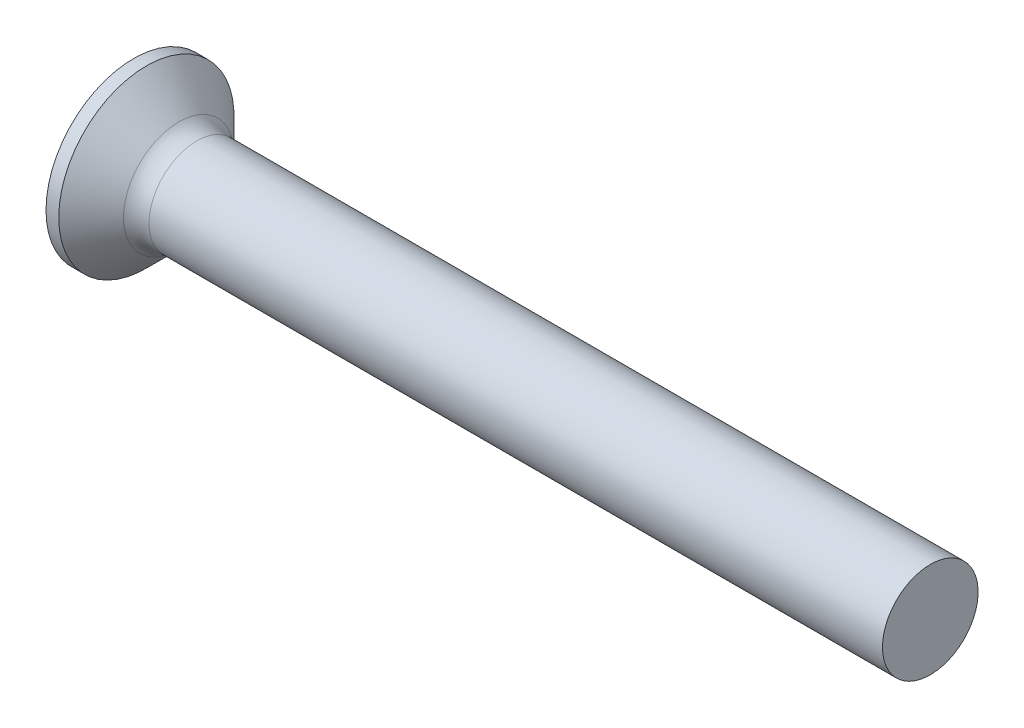
ISO-10303-21;
HEADER;
FILE_DESCRIPTION(('STEP AP214'),'2;1');
FILE_NAME('part.step','',(''),(''),'','','');
FILE_SCHEMA(('AUTOMOTIVE_DESIGN { 1 0 10303 214 1 1 1 1 }'));
ENDSEC;
DATA;
#1=APPLICATION_CONTEXT('core data for automotive mechanical design processes');
#2=APPLICATION_PROTOCOL_DEFINITION('international standard','automotive_design',2000,#1);
#3=PRODUCT_CONTEXT('',#1,'mechanical');
#4=PRODUCT('Part','Part','',(#3));
#5=PRODUCT_RELATED_PRODUCT_CATEGORY('part','',(#4));
#6=PRODUCT_DEFINITION_FORMATION('','',#4);
#7=PRODUCT_DEFINITION_CONTEXT('part definition',#1,'design');
#8=PRODUCT_DEFINITION('design','',#6,#7);
#9=PRODUCT_DEFINITION_SHAPE('','',#8);
#10=(LENGTH_UNIT() NAMED_UNIT(*) SI_UNIT(.MILLI.,.METRE.));
#11=(NAMED_UNIT(*) PLANE_ANGLE_UNIT() SI_UNIT($,.RADIAN.));
#12=(NAMED_UNIT(*) SI_UNIT($,.STERADIAN.) SOLID_ANGLE_UNIT());
#13=UNCERTAINTY_MEASURE_WITH_UNIT(LENGTH_MEASURE(1.E-05),#10,'distance_accuracy_value','');
#14=(GEOMETRIC_REPRESENTATION_CONTEXT(3) GLOBAL_UNCERTAINTY_ASSIGNED_CONTEXT((#13)) GLOBAL_UNIT_ASSIGNED_CONTEXT((#10,
#11,#12)) REPRESENTATION_CONTEXT('',''));
#15=CARTESIAN_POINT('',(0.,0.,0.));
#16=DIRECTION('',(0.,0.,1.));
#17=DIRECTION('',(1.,0.,0.));
#18=AXIS2_PLACEMENT_3D('',#15,#16,#17);
#19=CARTESIAN_POINT('',(5.75178571428571,0.,0.));
#20=DIRECTION('',(-1.,0.,0.));
#21=DIRECTION('',(0.,-1.,0.));
#22=AXIS2_PLACEMENT_3D('',#19,#20,#21);
#23=SPHERICAL_SURFACE('',#22,5.75178571428571);
#24=CARTESIAN_POINT('',(0.699999999999999,0.,0.));
#25=DIRECTION('',(-1.,0.,0.));
#26=DIRECTION('',(0.,0.,1.));
#27=AXIS2_PLACEMENT_3D('',#24,#25,#26);
#28=CIRCLE('',#27,2.75);
#29=CARTESIAN_POINT('',(0.699999999999999,0.,2.75));
#30=VERTEX_POINT('',#29);
#31=EDGE_CURVE('E225',#30,#30,#28,.T.);
#32=ORIENTED_EDGE('',*,*,#31,.T.);
#33=EDGE_LOOP('',(#32));
#34=FACE_BOUND('',#33,.T.);
#35=CARTESIAN_POINT('',(5.75178571428571,0.37,0.));
#36=DIRECTION('',(0.,-1.,0.));
#37=DIRECTION('',(0.,0.,-1.));
#38=AXIS2_PLACEMENT_3D('',#35,#36,#37);
#39=CIRCLE('',#38,5.73987272533645);
#40=CARTESIAN_POINT('',(0.198367443424474,0.370000000000005,-1.45109765761156));
#41=VERTEX_POINT('',#40);
#42=CARTESIAN_POINT('',(0.0425671244924341,0.370000000000002,-0.592420456280885));
#43=VERTEX_POINT('',#42);
#44=EDGE_CURVE('E306',#41,#43,#39,.F.);
#45=ORIENTED_EDGE('',*,*,#44,.T.);
#46=CARTESIAN_POINT('',(0.0425671244924332,0.,0.));
#47=DIRECTION('',(1.,0.,0.));
#48=DIRECTION('',(0.,0.,-1.));
#49=AXIS2_PLACEMENT_3D('',#46,#47,#48);
#50=CIRCLE('',#49,0.698471185533128);
#51=CARTESIAN_POINT('',(0.0425671244924327,0.592420456280879,-0.37));
#52=VERTEX_POINT('',#51);
#53=EDGE_CURVE('E342',#43,#52,#50,.T.);
#54=ORIENTED_EDGE('',*,*,#53,.T.);
#55=CARTESIAN_POINT('',(5.75178571428571,0.,-0.37));
#56=DIRECTION('',(0.,0.,1.));
#57=DIRECTION('',(1.,0.,0.));
#58=AXIS2_PLACEMENT_3D('',#55,#56,#57);
#59=CIRCLE('',#58,5.73987272533645);
#60=CARTESIAN_POINT('',(0.198367443424473,1.45109765761156,-0.37));
#61=VERTEX_POINT('',#60);
#62=EDGE_CURVE('E247',#52,#61,#59,.F.);
#63=ORIENTED_EDGE('',*,*,#62,.T.);
#64=CARTESIAN_POINT('',(5.22559114829425,-1.05538320204419,0.));
#65=DIRECTION('',(0.446197753347436,0.894934391398443,0.));
#66=DIRECTION('',(-0.894934391398443,0.446197753347436,0.));
#67=AXIS2_PLACEMENT_3D('',#64,#65,#66);
#68=CIRCLE('',#67,5.629593633525);
#69=CARTESIAN_POINT('',(0.198367443424473,1.45109765761156,0.37));
#70=VERTEX_POINT('',#69);
#71=EDGE_CURVE('E251',#70,#61,#68,.F.);
#72=ORIENTED_EDGE('',*,*,#71,.F.);
#73=CARTESIAN_POINT('',(5.75178571428571,0.,0.37));
#74=DIRECTION('',(0.,0.,-1.));
#75=DIRECTION('',(0.,1.,0.));
#76=AXIS2_PLACEMENT_3D('',#73,#74,#75);
#77=CIRCLE('',#76,5.73987272533645);
#78=CARTESIAN_POINT('',(0.0425671244924327,0.592420456280879,0.37));
#79=VERTEX_POINT('',#78);
#80=EDGE_CURVE('E244',#70,#79,#77,.F.);
#81=ORIENTED_EDGE('',*,*,#80,.T.);
#82=CARTESIAN_POINT('',(0.0425671244924344,0.369999999999998,0.592420456280887));
#83=VERTEX_POINT('',#82);
#84=EDGE_CURVE('E417',#79,#83,#50,.T.);
#85=ORIENTED_EDGE('',*,*,#84,.T.);
#86=CARTESIAN_POINT('',(0.198367443424473,0.369999999999995,1.45109765761157));
#87=VERTEX_POINT('',#86);
#88=EDGE_CURVE('E273',#83,#87,#39,.F.);
#89=ORIENTED_EDGE('',*,*,#88,.T.);
#90=CARTESIAN_POINT('',(5.22559114829425,0.,-1.05538320204419));
#91=DIRECTION('',(0.446197753347436,0.,0.894934391398443));
#92=DIRECTION('',(0.894934391398443,0.,-0.446197753347436));
#93=AXIS2_PLACEMENT_3D('',#90,#91,#92);
#94=CIRCLE('',#93,5.629593633525);
#95=CARTESIAN_POINT('',(0.198367443424473,-0.370000000000005,1.45109765761156));
#96=VERTEX_POINT('',#95);
#97=EDGE_CURVE('E45',#96,#87,#94,.F.);
#98=ORIENTED_EDGE('',*,*,#97,.F.);
#99=CARTESIAN_POINT('',(5.75178571428571,-0.37,0.));
#100=DIRECTION('',(0.,1.,0.));
#101=DIRECTION('',(0.,0.,1.));
#102=AXIS2_PLACEMENT_3D('',#99,#100,#101);
#103=CIRCLE('',#102,5.73987272533645);
#104=CARTESIAN_POINT('',(0.0425671244924341,-0.370000000000002,0.592420456280885));
#105=VERTEX_POINT('',#104);
#106=EDGE_CURVE('E277',#96,#105,#103,.F.);
#107=ORIENTED_EDGE('',*,*,#106,.T.);
#108=CARTESIAN_POINT('',(0.0425671244924327,-0.592420456280879,0.37));
#109=VERTEX_POINT('',#108);
#110=EDGE_CURVE('E634',#105,#109,#50,.T.);
#111=ORIENTED_EDGE('',*,*,#110,.T.);
#112=CARTESIAN_POINT('',(0.198367443424473,-1.45109765761156,0.37));
#113=VERTEX_POINT('',#112);
#114=EDGE_CURVE('E243',#109,#113,#77,.F.);
#115=ORIENTED_EDGE('',*,*,#114,.T.);
#116=CARTESIAN_POINT('',(5.22559114829425,1.05538320204419,0.));
#117=DIRECTION('',(0.446197753347436,-0.894934391398443,0.));
#118=DIRECTION('',(0.894934391398443,0.446197753347436,0.));
#119=AXIS2_PLACEMENT_3D('',#116,#117,#118);
#120=CIRCLE('',#119,5.629593633525);
#121=CARTESIAN_POINT('',(0.198367443424473,-1.45109765761156,-0.37));
#122=VERTEX_POINT('',#121);
#123=EDGE_CURVE('E241',#122,#113,#120,.F.);
#124=ORIENTED_EDGE('',*,*,#123,.F.);
#125=CARTESIAN_POINT('',(0.0425671244924327,-0.592420456280879,-0.37));
#126=VERTEX_POINT('',#125);
#127=EDGE_CURVE('E248',#122,#126,#59,.F.);
#128=ORIENTED_EDGE('',*,*,#127,.T.);
#129=CARTESIAN_POINT('',(0.0425671244924348,-0.369999999999998,-0.592420456280887));
#130=VERTEX_POINT('',#129);
#131=EDGE_CURVE('E372',#126,#130,#50,.T.);
#132=ORIENTED_EDGE('',*,*,#131,.T.);
#133=CARTESIAN_POINT('',(0.198367443424474,-0.369999999999995,-1.45109765761157));
#134=VERTEX_POINT('',#133);
#135=EDGE_CURVE('E279',#130,#134,#103,.F.);
#136=ORIENTED_EDGE('',*,*,#135,.T.);
#137=CARTESIAN_POINT('',(5.22559114829425,0.,1.05538320204419));
#138=DIRECTION('',(0.446197753347436,0.,-0.894934391398443));
#139=DIRECTION('',(-0.894934391398443,0.,-0.446197753347436));
#140=AXIS2_PLACEMENT_3D('',#137,#138,#139);
#141=CIRCLE('',#140,5.629593633525);
#142=EDGE_CURVE('E254',#41,#134,#141,.F.);
#143=ORIENTED_EDGE('',*,*,#142,.F.);
#144=EDGE_LOOP('',(#45,#54,#63,#72,#81,#85,#89,#98,#107,#111,#115,#124,#128,#132,#136,#143));
#145=FACE_BOUND('',#144,.T.);
#146=ADVANCED_FACE('F37',(#34,#145),#23,.T.);
#147=CARTESIAN_POINT('',(0.,1.55,-0.37));
#148=DIRECTION('',(0.,0.,1.));
#149=DIRECTION('',(1.,0.,0.));
#150=AXIS2_PLACEMENT_3D('',#147,#148,#149);
#151=PLANE('',#150);
#152=ORIENTED_EDGE('',*,*,#62,.F.);
#153=CARTESIAN_POINT('',(-0.98610863383905,0.675737444130957,-0.37));
#154=CARTESIAN_POINT('',(-0.774401024917671,0.658853686256422,-0.37));
#155=CARTESIAN_POINT('',(-0.56270392162146,0.641835849346199,-0.37));
#156=CARTESIAN_POINT('',(-0.139335591881705,0.607430344801115,-0.37));
#157=CARTESIAN_POINT('',(0.0723356339683211,0.590042669870088,-0.37));
#158=CARTESIAN_POINT('',(0.495638906041736,0.554796481702077,-0.37));
#159=CARTESIAN_POINT('',(0.707270952279085,0.536937968633182,-0.37));
#160=CARTESIAN_POINT('',(1.13047821918517,0.500589740538852,-0.37));
#161=CARTESIAN_POINT('',(1.34205344057783,0.482100033980559,-0.37));
#162=CARTESIAN_POINT('',(1.7126422349985,0.448931877712391,-0.37));
#163=CARTESIAN_POINT('',(1.87167298820047,0.434445978314768,-0.37));
#164=CARTESIAN_POINT('',(2.18967047903985,0.404800340258253,-0.37));
#165=CARTESIAN_POINT('',(2.34863721722439,0.3896406074874,-0.37));
#166=CARTESIAN_POINT('',(2.66648832719461,0.358378663830572,-0.37));
#167=CARTESIAN_POINT('',(2.82537269367797,0.342276398422204,-0.37));
#168=CARTESIAN_POINT('',(3.06358912313363,0.317054873685041,-0.37));
#169=CARTESIAN_POINT('',(3.14297750534347,0.308469532933521,-0.37));
#170=CARTESIAN_POINT('',(3.30170304596355,0.290830230925068,-0.37));
#171=CARTESIAN_POINT('',(3.38104020374595,0.281776264030692,-0.37));
#172=CARTESIAN_POINT('',(3.460343956577,0.272431763009211,-0.37));
#173=B_SPLINE_CURVE_WITH_KNOTS('',3,(#153,#154,#155,#156,#157,#158,#159,#160,#161,#162,#163,
#164,#165,#166,#167,#168,#169,#170,#171,#172),.UNSPECIFIED.,.F.,.F.,(4,2,2,2,2,2,2,2,2,4),(0.,
0.637139595455107,1.27429177208145,1.91144372124687,2.54858712669655,3.02765347728825,
3.50671564256163,3.98580554743446,4.22535810389142,4.46491354276891),.UNSPECIFIED.);
#174=CARTESIAN_POINT('',(2.08,0.415013252800437,-0.37));
#175=VERTEX_POINT('',#174);
#176=EDGE_CURVE('E395',#52,#175,#173,.T.);
#177=ORIENTED_EDGE('',*,*,#176,.T.);
#178=DIRECTION('',(0.,1.,0.));
#179=VECTOR('',#178,1.);
#180=CARTESIAN_POINT('',(2.08,-0.512950428676216,-0.37));
#181=LINE('',#180,#179);
#182=CARTESIAN_POINT('',(2.08,0.512950428676215,-0.37));
#183=VERTEX_POINT('',#182);
#184=EDGE_CURVE('E333',#175,#183,#181,.T.);
#185=ORIENTED_EDGE('',*,*,#184,.T.);
#186=DIRECTION('',(0.894934391398443,-0.446197753347436,0.));
#187=VECTOR('',#186,1.);
#188=CARTESIAN_POINT('',(0.,1.55,-0.37));
#189=LINE('',#188,#187);
#190=EDGE_CURVE('E222',#61,#183,#189,.T.);
#191=ORIENTED_EDGE('',*,*,#190,.F.);
#192=EDGE_LOOP('',(#152,#177,#185,#191));
#193=FACE_BOUND('',#192,.T.);
#194=ADVANCED_FACE('F190',(#193),#151,.T.);
#195=CARTESIAN_POINT('',(2.08,-0.512950428676216,-0.37));
#196=VERTEX_POINT('',#195);
#197=CARTESIAN_POINT('',(2.08,-0.415013252800437,-0.37));
#198=VERTEX_POINT('',#197);
#199=EDGE_CURVE('E231',#196,#198,#181,.T.);
#200=ORIENTED_EDGE('',*,*,#199,.T.);
#201=CARTESIAN_POINT('',(-0.98610863383905,-0.675737444130957,-0.37));
#202=CARTESIAN_POINT('',(-0.774401024917671,-0.658853686256422,-0.37));
#203=CARTESIAN_POINT('',(-0.56270392162146,-0.641835849346199,-0.37));
#204=CARTESIAN_POINT('',(-0.139335591881705,-0.607430344801115,-0.37));
#205=CARTESIAN_POINT('',(0.0723356339683213,-0.590042669870088,-0.37));
#206=CARTESIAN_POINT('',(0.495638906041736,-0.554796481702077,-0.37));
#207=CARTESIAN_POINT('',(0.707270952279084,-0.536937968633182,-0.37));
#208=CARTESIAN_POINT('',(1.13047821918517,-0.500589740538852,-0.37));
#209=CARTESIAN_POINT('',(1.34205344057783,-0.482100033980559,-0.37));
#210=CARTESIAN_POINT('',(1.7126422349985,-0.448931877712391,-0.37));
#211=CARTESIAN_POINT('',(1.87167298820047,-0.434445978314768,-0.37));
#212=CARTESIAN_POINT('',(2.18967047903985,-0.404800340258253,-0.37));
#213=CARTESIAN_POINT('',(2.34863721722439,-0.3896406074874,-0.37));
#214=CARTESIAN_POINT('',(2.66648832719461,-0.358378663830572,-0.37));
#215=CARTESIAN_POINT('',(2.82537269367797,-0.342276398422204,-0.37));
#216=CARTESIAN_POINT('',(3.06358912313363,-0.317054873685041,-0.37));
#217=CARTESIAN_POINT('',(3.14297750534347,-0.308469532933521,-0.37));
#218=CARTESIAN_POINT('',(3.30170304596355,-0.290830230925068,-0.37));
#219=CARTESIAN_POINT('',(3.38104020374595,-0.281776264030692,-0.37));
#220=CARTESIAN_POINT('',(3.460343956577,-0.272431763009211,-0.37));
#221=B_SPLINE_CURVE_WITH_KNOTS('',3,(#201,#202,#203,#204,#205,#206,#207,#208,#209,#210,#211,
#212,#213,#214,#215,#216,#217,#218,#219,#220),.UNSPECIFIED.,.F.,.F.,(4,2,2,2,2,2,2,2,2,4),(0.,
0.637139595455107,1.27429177208145,1.91144372124687,2.54858712669655,3.02765347728825,
3.50671564256163,3.98580554743446,4.22535810389142,4.46491354276891),.UNSPECIFIED.);
#222=EDGE_CURVE('E384',#198,#126,#221,.F.);
#223=ORIENTED_EDGE('',*,*,#222,.T.);
#224=ORIENTED_EDGE('',*,*,#127,.F.);
#225=DIRECTION('',(0.894934391398443,0.446197753347436,0.));
#226=VECTOR('',#225,1.);
#227=CARTESIAN_POINT('',(0.,-1.55,-0.37));
#228=LINE('',#227,#226);
#229=EDGE_CURVE('E60',#122,#196,#228,.T.);
#230=ORIENTED_EDGE('',*,*,#229,.T.);
#231=EDGE_LOOP('',(#200,#223,#224,#230));
#232=FACE_BOUND('',#231,.T.);
#233=ADVANCED_FACE('F196',(#232),#151,.T.);
#234=CARTESIAN_POINT('',(0.,-1.55,0.37));
#235=DIRECTION('',(0.,0.,-1.));
#236=DIRECTION('',(0.,1.,0.));
#237=AXIS2_PLACEMENT_3D('',#234,#235,#236);
#238=PLANE('',#237);
#239=DIRECTION('',(0.,-1.,0.));
#240=VECTOR('',#239,1.);
#241=CARTESIAN_POINT('',(2.08,0.512950428676216,0.37));
#242=LINE('',#241,#240);
#243=CARTESIAN_POINT('',(2.08,0.512950428676215,0.37));
#244=VERTEX_POINT('',#243);
#245=CARTESIAN_POINT('',(2.08,0.415013252800437,0.37));
#246=VERTEX_POINT('',#245);
#247=EDGE_CURVE('E317',#244,#246,#242,.T.);
#248=ORIENTED_EDGE('',*,*,#247,.T.);
#249=CARTESIAN_POINT('',(-0.98610863383905,0.675737444130957,0.37));
#250=CARTESIAN_POINT('',(-0.774401024917671,0.658853686256422,0.37));
#251=CARTESIAN_POINT('',(-0.56270392162146,0.641835849346199,0.37));
#252=CARTESIAN_POINT('',(-0.139335591881705,0.607430344801115,0.37));
#253=CARTESIAN_POINT('',(0.0723356339683211,0.590042669870088,0.37));
#254=CARTESIAN_POINT('',(0.495638906041736,0.554796481702077,0.37));
#255=CARTESIAN_POINT('',(0.707270952279085,0.536937968633182,0.37));
#256=CARTESIAN_POINT('',(1.13047821918517,0.500589740538852,0.37));
#257=CARTESIAN_POINT('',(1.34205344057783,0.482100033980559,0.37));
#258=CARTESIAN_POINT('',(1.7126422349985,0.448931877712391,0.37));
#259=CARTESIAN_POINT('',(1.87167298820047,0.434445978314768,0.37));
#260=CARTESIAN_POINT('',(2.18967047903985,0.404800340258253,0.37));
#261=CARTESIAN_POINT('',(2.34863721722439,0.3896406074874,0.37));
#262=CARTESIAN_POINT('',(2.66648832719461,0.358378663830572,0.37));
#263=CARTESIAN_POINT('',(2.82537269367797,0.342276398422204,0.37));
#264=CARTESIAN_POINT('',(3.06358912313363,0.317054873685041,0.37));
#265=CARTESIAN_POINT('',(3.14297750534347,0.308469532933521,0.37));
#266=CARTESIAN_POINT('',(3.30170304596355,0.290830230925068,0.37));
#267=CARTESIAN_POINT('',(3.38104020374595,0.281776264030692,0.37));
#268=CARTESIAN_POINT('',(3.460343956577,0.272431763009211,0.37));
#269=B_SPLINE_CURVE_WITH_KNOTS('',3,(#249,#250,#251,#252,#253,#254,#255,#256,#257,#258,#259,
#260,#261,#262,#263,#264,#265,#266,#267,#268),.UNSPECIFIED.,.F.,.F.,(4,2,2,2,2,2,2,2,2,4),(0.,
0.637139595455107,1.27429177208145,1.91144372124687,2.54858712669655,3.02765347728825,
3.50671564256163,3.98580554743446,4.22535810389142,4.46491354276891),.UNSPECIFIED.);
#270=EDGE_CURVE('E418',#246,#79,#269,.F.);
#271=ORIENTED_EDGE('',*,*,#270,.T.);
#272=ORIENTED_EDGE('',*,*,#80,.F.);
#273=DIRECTION('',(0.894934391398443,-0.446197753347436,0.));
#274=VECTOR('',#273,1.);
#275=CARTESIAN_POINT('',(0.,1.55,0.37));
#276=LINE('',#275,#274);
#277=EDGE_CURVE('E228',#70,#244,#276,.T.);
#278=ORIENTED_EDGE('',*,*,#277,.T.);
#279=EDGE_LOOP('',(#248,#271,#272,#278));
#280=FACE_BOUND('',#279,.T.);
#281=ADVANCED_FACE('F542',(#280),#238,.T.);
#282=ORIENTED_EDGE('',*,*,#114,.F.);
#283=CARTESIAN_POINT('',(-0.98610863383905,-0.675737444130957,0.37));
#284=CARTESIAN_POINT('',(-0.774401024917671,-0.658853686256422,0.37));
#285=CARTESIAN_POINT('',(-0.56270392162146,-0.641835849346199,0.37));
#286=CARTESIAN_POINT('',(-0.139335591881705,-0.607430344801115,0.37));
#287=CARTESIAN_POINT('',(0.0723356339683212,-0.590042669870088,0.37));
#288=CARTESIAN_POINT('',(0.495638906041736,-0.554796481702077,0.37));
#289=CARTESIAN_POINT('',(0.707270952279085,-0.536937968633182,0.37));
#290=CARTESIAN_POINT('',(1.13047821918517,-0.500589740538852,0.37));
#291=CARTESIAN_POINT('',(1.34205344057783,-0.482100033980559,0.37));
#292=CARTESIAN_POINT('',(1.7126422349985,-0.448931877712391,0.37));
#293=CARTESIAN_POINT('',(1.87167298820047,-0.434445978314768,0.37));
#294=CARTESIAN_POINT('',(2.18967047903985,-0.404800340258253,0.37));
#295=CARTESIAN_POINT('',(2.34863721722439,-0.3896406074874,0.37));
#296=CARTESIAN_POINT('',(2.66648832719461,-0.358378663830572,0.37));
#297=CARTESIAN_POINT('',(2.82537269367797,-0.342276398422204,0.37));
#298=CARTESIAN_POINT('',(3.06358912313363,-0.317054873685041,0.37));
#299=CARTESIAN_POINT('',(3.14297750534347,-0.308469532933521,0.37));
#300=CARTESIAN_POINT('',(3.30170304596355,-0.290830230925068,0.37));
#301=CARTESIAN_POINT('',(3.38104020374595,-0.281776264030692,0.37));
#302=CARTESIAN_POINT('',(3.460343956577,-0.272431763009211,0.37));
#303=B_SPLINE_CURVE_WITH_KNOTS('',3,(#283,#284,#285,#286,#287,#288,#289,#290,#291,#292,#293,
#294,#295,#296,#297,#298,#299,#300,#301,#302),.UNSPECIFIED.,.F.,.F.,(4,2,2,2,2,2,2,2,2,4),(0.,
0.637139595455107,1.27429177208145,1.91144372124687,2.54858712669655,3.02765347728825,
3.50671564256163,3.98580554743446,4.22535810389142,4.46491354276891),.UNSPECIFIED.);
#304=CARTESIAN_POINT('',(2.08,-0.415013252800437,0.37));
#305=VERTEX_POINT('',#304);
#306=EDGE_CURVE('E407',#109,#305,#303,.T.);
#307=ORIENTED_EDGE('',*,*,#306,.T.);
#308=CARTESIAN_POINT('',(2.08,-0.512950428676216,0.37));
#309=VERTEX_POINT('',#308);
#310=EDGE_CURVE('E319',#305,#309,#242,.T.);
#311=ORIENTED_EDGE('',*,*,#310,.T.);
#312=DIRECTION('',(0.894934391398443,0.446197753347436,0.));
#313=VECTOR('',#312,1.);
#314=CARTESIAN_POINT('',(0.,-1.55,0.37));
#315=LINE('',#314,#313);
#316=EDGE_CURVE('E310',#113,#309,#315,.T.);
#317=ORIENTED_EDGE('',*,*,#316,.F.);
#318=EDGE_LOOP('',(#282,#307,#311,#317));
#319=FACE_BOUND('',#318,.T.);
#320=ADVANCED_FACE('F533',(#319),#238,.T.);
#321=CARTESIAN_POINT('',(2.08,0.512950428676216,-0.37));
#322=DIRECTION('',(-1.,0.,0.));
#323=DIRECTION('',(0.,0.,1.));
#324=AXIS2_PLACEMENT_3D('',#321,#322,#323);
#325=PLANE('',#324);
#326=DIRECTION('',(0.,1.,0.));
#327=VECTOR('',#326,1.);
#328=CARTESIAN_POINT('',(2.08,-0.370000000000002,0.512950428676214));
#329=LINE('',#328,#327);
#330=CARTESIAN_POINT('',(2.08,-0.370000000000002,0.512950428676214));
#331=VERTEX_POINT('',#330);
#332=CARTESIAN_POINT('',(2.08,-0.214517732882126,0.512950428676215));
#333=VERTEX_POINT('',#332);
#334=EDGE_CURVE('E299',#331,#333,#329,.T.);
#335=ORIENTED_EDGE('',*,*,#334,.T.);
#336=CARTESIAN_POINT('',(2.08,0.,0.));
#337=DIRECTION('',(-1.,0.,0.));
#338=DIRECTION('',(0.,0.,1.));
#339=AXIS2_PLACEMENT_3D('',#336,#337,#338);
#340=CIRCLE('',#339,0.555999999999999);
#341=CARTESIAN_POINT('',(2.08,-0.370000000000001,0.415013252800436));
#342=VERTEX_POINT('',#341);
#343=EDGE_CURVE('E664',#342,#333,#340,.T.);
#344=ORIENTED_EDGE('',*,*,#343,.F.);
#345=DIRECTION('',(0.,0.,-1.));
#346=VECTOR('',#345,1.);
#347=CARTESIAN_POINT('',(2.08,-0.370000000000002,0.512950428676214));
#348=LINE('',#347,#346);
#349=EDGE_CURVE('E295',#331,#342,#348,.T.);
#350=ORIENTED_EDGE('',*,*,#349,.F.);
#351=EDGE_LOOP('',(#335,#344,#350));
#352=FACE_BOUND('',#351,.T.);
#353=ADVANCED_FACE('F523',(#352),#325,.T.);
#354=ORIENTED_EDGE('',*,*,#310,.F.);
#355=CARTESIAN_POINT('',(2.08,-0.512950428676216,0.214517732882124));
#356=VERTEX_POINT('',#355);
#357=EDGE_CURVE('E660',#356,#305,#340,.T.);
#358=ORIENTED_EDGE('',*,*,#357,.F.);
#359=DIRECTION('',(0.,0.,1.));
#360=VECTOR('',#359,1.);
#361=CARTESIAN_POINT('',(2.08,-0.512950428676216,-0.37));
#362=LINE('',#361,#360);
#363=EDGE_CURVE('E316',#356,#309,#362,.T.);
#364=ORIENTED_EDGE('',*,*,#363,.T.);
#365=EDGE_LOOP('',(#354,#358,#364));
#366=FACE_BOUND('',#365,.T.);
#367=ADVANCED_FACE('F513',(#366),#325,.T.);
#368=CARTESIAN_POINT('',(2.08,-0.512950428676216,-0.214517732882124));
#369=VERTEX_POINT('',#368);
#370=EDGE_CURVE('E313',#196,#369,#362,.T.);
#371=ORIENTED_EDGE('',*,*,#370,.T.);
#372=EDGE_CURVE('E657',#198,#369,#340,.T.);
#373=ORIENTED_EDGE('',*,*,#372,.F.);
#374=ORIENTED_EDGE('',*,*,#199,.F.);
#375=EDGE_LOOP('',(#371,#373,#374));
#376=FACE_BOUND('',#375,.T.);
#377=ADVANCED_FACE('F503',(#376),#325,.T.);
#378=CARTESIAN_POINT('',(2.08,-0.369999999999998,-0.415013252800438));
#379=VERTEX_POINT('',#378);
#380=CARTESIAN_POINT('',(2.08,-0.369999999999998,-0.512950428676217));
#381=VERTEX_POINT('',#380);
#382=EDGE_CURVE('E298',#379,#381,#348,.T.);
#383=ORIENTED_EDGE('',*,*,#382,.F.);
#384=CARTESIAN_POINT('',(2.08,-0.214517732882122,-0.512950428676216));
#385=VERTEX_POINT('',#384);
#386=EDGE_CURVE('E360',#385,#379,#340,.T.);
#387=ORIENTED_EDGE('',*,*,#386,.F.);
#388=DIRECTION('',(0.,-1.,0.));
#389=VECTOR('',#388,1.);
#390=CARTESIAN_POINT('',(2.08,0.370000000000002,-0.512950428676214));
#391=LINE('',#390,#389);
#392=EDGE_CURVE('E294',#385,#381,#391,.T.);
#393=ORIENTED_EDGE('',*,*,#392,.T.);
#394=EDGE_LOOP('',(#383,#387,#393));
#395=FACE_BOUND('',#394,.T.);
#396=ADVANCED_FACE('F494',(#395),#325,.T.);
#397=CARTESIAN_POINT('',(2.08,0.370000000000002,-0.512950428676214));
#398=VERTEX_POINT('',#397);
#399=CARTESIAN_POINT('',(2.08,0.214517732882126,-0.512950428676215));
#400=VERTEX_POINT('',#399);
#401=EDGE_CURVE('E291',#398,#400,#391,.T.);
#402=ORIENTED_EDGE('',*,*,#401,.T.);
#403=CARTESIAN_POINT('',(2.08,0.370000000000001,-0.415013252800436));
#404=VERTEX_POINT('',#403);
#405=EDGE_CURVE('E52',#404,#400,#340,.T.);
#406=ORIENTED_EDGE('',*,*,#405,.F.);
#407=DIRECTION('',(0.,0.,1.));
#408=VECTOR('',#407,1.);
#409=CARTESIAN_POINT('',(2.08,0.370000000000002,-0.512950428676214));
#410=LINE('',#409,#408);
#411=EDGE_CURVE('E303',#398,#404,#410,.T.);
#412=ORIENTED_EDGE('',*,*,#411,.F.);
#413=EDGE_LOOP('',(#402,#406,#412));
#414=FACE_BOUND('',#413,.T.);
#415=ADVANCED_FACE('F355',(#414),#325,.T.);
#416=ORIENTED_EDGE('',*,*,#184,.F.);
#417=CARTESIAN_POINT('',(2.08,0.512950428676216,-0.214517732882124));
#418=VERTEX_POINT('',#417);
#419=EDGE_CURVE('E359',#418,#175,#340,.T.);
#420=ORIENTED_EDGE('',*,*,#419,.F.);
#421=DIRECTION('',(0.,0.,-1.));
#422=VECTOR('',#421,1.);
#423=CARTESIAN_POINT('',(2.08,0.512950428676216,0.37));
#424=LINE('',#423,#422);
#425=EDGE_CURVE('E322',#418,#183,#424,.T.);
#426=ORIENTED_EDGE('',*,*,#425,.T.);
#427=EDGE_LOOP('',(#416,#420,#426));
#428=FACE_BOUND('',#427,.T.);
#429=ADVANCED_FACE('F475',(#428),#325,.T.);
#430=CARTESIAN_POINT('',(2.08,0.512950428676216,0.214517732882124));
#431=VERTEX_POINT('',#430);
#432=EDGE_CURVE('E320',#244,#431,#424,.T.);
#433=ORIENTED_EDGE('',*,*,#432,.T.);
#434=EDGE_CURVE('E682',#246,#431,#340,.T.);
#435=ORIENTED_EDGE('',*,*,#434,.F.);
#436=ORIENTED_EDGE('',*,*,#247,.F.);
#437=EDGE_LOOP('',(#433,#435,#436));
#438=FACE_BOUND('',#437,.T.);
#439=ADVANCED_FACE('F464',(#438),#325,.T.);
#440=CARTESIAN_POINT('',(2.08,0.512950428676216,0.37));
#441=DIRECTION('',(0.446197753347436,0.894934391398443,0.));
#442=DIRECTION('',(-0.894934391398443,0.446197753347436,0.));
#443=AXIS2_PLACEMENT_3D('',#440,#441,#442);
#444=PLANE('',#443);
#445=CARTESIAN_POINT('',(2.96992136525496,0.0692520775466322,0.));
#446=DIRECTION('',(0.446197753347436,0.894934391398443,0.));
#447=DIRECTION('',(-0.894934391398443,0.446197753347436,0.));
#448=AXIS2_PLACEMENT_3D('',#445,#446,#447);
#449=ELLIPSE('',#448,1.10661838241671,0.488890162283964);
#450=EDGE_CURVE('E284',#431,#418,#449,.F.);
#451=ORIENTED_EDGE('',*,*,#450,.F.);
#452=ORIENTED_EDGE('',*,*,#432,.F.);
#453=ORIENTED_EDGE('',*,*,#277,.F.);
#454=ORIENTED_EDGE('',*,*,#71,.T.);
#455=ORIENTED_EDGE('',*,*,#190,.T.);
#456=ORIENTED_EDGE('',*,*,#425,.F.);
#457=EDGE_LOOP('',(#451,#452,#453,#454,#455,#456));
#458=FACE_BOUND('',#457,.T.);
#459=ADVANCED_FACE('F431',(#458),#444,.F.);
#460=CARTESIAN_POINT('',(0.,-1.55,-0.37));
#461=DIRECTION('',(0.446197753347436,-0.894934391398443,0.));
#462=DIRECTION('',(0.894934391398443,0.446197753347436,0.));
#463=AXIS2_PLACEMENT_3D('',#460,#461,#462);
#464=PLANE('',#463);
#465=CARTESIAN_POINT('',(2.96992136525496,-0.0692520775466322,0.));
#466=DIRECTION('',(0.446197753347436,-0.894934391398443,0.));
#467=DIRECTION('',(-0.894934391398443,-0.446197753347436,0.));
#468=AXIS2_PLACEMENT_3D('',#465,#466,#467);
#469=ELLIPSE('',#468,1.10661838241671,0.488890162283964);
#470=EDGE_CURVE('E626',#369,#356,#469,.F.);
#471=ORIENTED_EDGE('',*,*,#470,.F.);
#472=ORIENTED_EDGE('',*,*,#370,.F.);
#473=ORIENTED_EDGE('',*,*,#229,.F.);
#474=ORIENTED_EDGE('',*,*,#123,.T.);
#475=ORIENTED_EDGE('',*,*,#316,.T.);
#476=ORIENTED_EDGE('',*,*,#363,.F.);
#477=EDGE_LOOP('',(#471,#472,#473,#474,#475,#476));
#478=FACE_BOUND('',#477,.T.);
#479=ADVANCED_FACE('F424',(#478),#464,.F.);
#480=CARTESIAN_POINT('',(0.,0.369999999999995,1.55));
#481=DIRECTION('',(0.,-1.,0.));
#482=DIRECTION('',(1.,0.,0.));
#483=AXIS2_PLACEMENT_3D('',#480,#481,#482);
#484=PLANE('',#483);
#485=ORIENTED_EDGE('',*,*,#88,.F.);
#486=CARTESIAN_POINT('',(-0.986108633926465,0.369999999999998,0.675737444137927));
#487=CARTESIAN_POINT('',(-0.774401024995322,0.369999999999998,0.658853686262654));
#488=CARTESIAN_POINT('',(-0.562703921689347,0.369999999999998,0.641835849351684));
#489=CARTESIAN_POINT('',(-0.139335591930065,0.369999999999998,0.607430344805081));
#490=CARTESIAN_POINT('',(0.0723356339297246,0.369999999999998,0.590042669873281));
#491=CARTESIAN_POINT('',(0.495638906032912,0.369999999999998,0.554796481702835));
#492=CARTESIAN_POINT('',(0.707270952290268,0.369999999999998,0.536937968632254));
#493=CARTESIAN_POINT('',(1.13047821923635,0.369999999999998,0.500589740534426));
#494=CARTESIAN_POINT('',(1.34205344064901,0.369999999999998,0.48210003397432));
#495=CARTESIAN_POINT('',(1.71264223508966,0.369999999999998,0.448931877704136));
#496=CARTESIAN_POINT('',(1.87167298829162,0.369999999999998,0.434445978306403));
#497=CARTESIAN_POINT('',(2.18967047913098,0.369999999999999,0.404800340249628));
#498=CARTESIAN_POINT('',(2.3486372173155,0.369999999999999,0.389640607478624));
#499=CARTESIAN_POINT('',(2.6664883272857,0.369999999999999,0.358378663821429));
#500=CARTESIAN_POINT('',(2.82537269376903,0.369999999999999,0.342276398412845));
#501=CARTESIAN_POINT('',(3.06358912322466,0.369999999999999,0.317054873675265));
#502=CARTESIAN_POINT('',(3.14297750543448,0.369999999999999,0.308469532923591));
#503=CARTESIAN_POINT('',(3.30170304605453,0.369999999999999,0.290830230914781));
#504=CARTESIAN_POINT('',(3.38104020383691,0.369999999999999,0.281776264020204));
#505=CARTESIAN_POINT('',(3.46034395666793,0.369999999999999,0.272431762998489));
#506=B_SPLINE_CURVE_WITH_KNOTS('',3,(#486,#487,#488,#489,#490,#491,#492,#493,#494,#495,#496,
#497,#498,#499,#500,#501,#502,#503,#504,#505),.UNSPECIFIED.,.F.,.F.,(4,2,2,2,2,2,2,2,2,4),(0.,
0.637139595484484,1.27429177214021,1.91144372136586,2.54858712687578,3.02765347746748,
3.50671564274086,3.9858055476137,4.22535810407067,4.46491354294816),.UNSPECIFIED.);
#507=CARTESIAN_POINT('',(2.08,0.369999999999999,0.415013252800438));
#508=VERTEX_POINT('',#507);
#509=EDGE_CURVE('E413',#83,#508,#506,.T.);
#510=ORIENTED_EDGE('',*,*,#509,.T.);
#511=CARTESIAN_POINT('',(2.08,0.369999999999998,0.512950428676217));
#512=VERTEX_POINT('',#511);
#513=EDGE_CURVE('E275',#508,#512,#410,.T.);
#514=ORIENTED_EDGE('',*,*,#513,.T.);
#515=DIRECTION('',(0.894934391398443,0.,-0.446197753347436));
#516=VECTOR('',#515,1.);
#517=CARTESIAN_POINT('',(0.,0.369999999999995,1.55));
#518=LINE('',#517,#516);
#519=EDGE_CURVE('E265',#87,#512,#518,.T.);
#520=ORIENTED_EDGE('',*,*,#519,.F.);
#521=EDGE_LOOP('',(#485,#510,#514,#520));
#522=FACE_BOUND('',#521,.T.);
#523=ADVANCED_FACE('F271',(#522),#484,.T.);
#524=CARTESIAN_POINT('',(0.,-0.369999999999994,-1.55));
#525=DIRECTION('',(0.,1.,0.));
#526=DIRECTION('',(0.,0.,1.));
#527=AXIS2_PLACEMENT_3D('',#524,#525,#526);
#528=PLANE('',#527);
#529=ORIENTED_EDGE('',*,*,#349,.T.);
#530=CARTESIAN_POINT('',(-0.986108633926465,-0.370000000000002,0.675737444137925));
#531=CARTESIAN_POINT('',(-0.774401024995322,-0.370000000000002,0.658853686262651));
#532=CARTESIAN_POINT('',(-0.562703921689347,-0.370000000000002,0.641835849351682));
#533=CARTESIAN_POINT('',(-0.139335591930065,-0.370000000000002,0.607430344805078));
#534=CARTESIAN_POINT('',(0.0723356339297244,-0.370000000000002,0.590042669873279));
#535=CARTESIAN_POINT('',(0.495638906032912,-0.370000000000002,0.554796481702832));
#536=CARTESIAN_POINT('',(0.707270952290268,-0.370000000000002,0.536937968632252));
#537=CARTESIAN_POINT('',(1.13047821923635,-0.370000000000002,0.500589740534423));
#538=CARTESIAN_POINT('',(1.34205344064901,-0.370000000000002,0.482100033974317));
#539=CARTESIAN_POINT('',(1.71264223508966,-0.370000000000001,0.448931877704133));
#540=CARTESIAN_POINT('',(1.87167298829162,-0.370000000000001,0.4344459783064));
#541=CARTESIAN_POINT('',(2.18967047913098,-0.370000000000001,0.404800340249625));
#542=CARTESIAN_POINT('',(2.3486372173155,-0.370000000000001,0.389640607478622));
#543=CARTESIAN_POINT('',(2.66648832728569,-0.370000000000001,0.358378663821427));
#544=CARTESIAN_POINT('',(2.82537269376903,-0.370000000000001,0.342276398412842));
#545=CARTESIAN_POINT('',(3.06358912322466,-0.370000000000001,0.317054873675262));
#546=CARTESIAN_POINT('',(3.14297750543448,-0.370000000000001,0.308469532923588));
#547=CARTESIAN_POINT('',(3.30170304605453,-0.370000000000001,0.290830230914778));
#548=CARTESIAN_POINT('',(3.38104020383691,-0.370000000000001,0.281776264020201));
#549=CARTESIAN_POINT('',(3.46034395666792,-0.370000000000001,0.272431762998486));
#550=B_SPLINE_CURVE_WITH_KNOTS('',3,(#530,#531,#532,#533,#534,#535,#536,#537,#538,#539,#540,
#541,#542,#543,#544,#545,#546,#547,#548,#549),.UNSPECIFIED.,.F.,.F.,(4,2,2,2,2,2,2,2,2,4),(0.,
0.637139595484484,1.27429177214021,1.91144372136586,2.54858712687577,3.02765347746748,
3.50671564274086,3.9858055476137,4.22535810407067,4.46491354294816),.UNSPECIFIED.);
#551=EDGE_CURVE('E402',#342,#105,#550,.F.);
#552=ORIENTED_EDGE('',*,*,#551,.T.);
#553=ORIENTED_EDGE('',*,*,#106,.F.);
#554=DIRECTION('',(0.894934391398443,0.,-0.446197753347436));
#555=VECTOR('',#554,1.);
#556=CARTESIAN_POINT('',(0.,-0.370000000000005,1.55));
#557=LINE('',#556,#555);
#558=EDGE_CURVE('E267',#96,#331,#557,.T.);
#559=ORIENTED_EDGE('',*,*,#558,.T.);
#560=EDGE_LOOP('',(#529,#552,#553,#559));
#561=FACE_BOUND('',#560,.T.);
#562=ADVANCED_FACE('F374',(#561),#528,.T.);
#563=CARTESIAN_POINT('',(2.08,-0.370000000000002,0.512950428676214));
#564=DIRECTION('',(0.446197753347436,0.,0.894934391398443));
#565=DIRECTION('',(-0.894934391398443,0.,0.446197753347436));
#566=AXIS2_PLACEMENT_3D('',#563,#564,#565);
#567=PLANE('',#566);
#568=CARTESIAN_POINT('',(2.96992136525496,0.,0.0692520775466322));
#569=DIRECTION('',(0.446197753347436,0.,0.894934391398443));
#570=DIRECTION('',(-0.894934391398443,0.,0.446197753347436));
#571=AXIS2_PLACEMENT_3D('',#568,#569,#570);
#572=ELLIPSE('',#571,1.10661838241671,0.488890162283964);
#573=CARTESIAN_POINT('',(2.08,0.214517732882122,0.512950428676216));
#574=VERTEX_POINT('',#573);
#575=EDGE_CURVE('E638',#333,#574,#572,.F.);
#576=ORIENTED_EDGE('',*,*,#575,.F.);
#577=ORIENTED_EDGE('',*,*,#334,.F.);
#578=ORIENTED_EDGE('',*,*,#558,.F.);
#579=ORIENTED_EDGE('',*,*,#97,.T.);
#580=ORIENTED_EDGE('',*,*,#519,.T.);
#581=EDGE_CURVE('E302',#574,#512,#329,.T.);
#582=ORIENTED_EDGE('',*,*,#581,.F.);
#583=EDGE_LOOP('',(#576,#577,#578,#579,#580,#582));
#584=FACE_BOUND('',#583,.T.);
#585=ADVANCED_FACE('F263',(#584),#567,.F.);
#586=ORIENTED_EDGE('',*,*,#411,.T.);
#587=CARTESIAN_POINT('',(-0.986108633926465,0.370000000000002,-0.675737444137925));
#588=CARTESIAN_POINT('',(-0.774401024995322,0.370000000000002,-0.658853686262651));
#589=CARTESIAN_POINT('',(-0.562703921689347,0.370000000000002,-0.641835849351681));
#590=CARTESIAN_POINT('',(-0.139335591930065,0.370000000000002,-0.607430344805078));
#591=CARTESIAN_POINT('',(0.0723356339297244,0.370000000000002,-0.590042669873279));
#592=CARTESIAN_POINT('',(0.495638906032912,0.370000000000002,-0.554796481702832));
#593=CARTESIAN_POINT('',(0.707270952290268,0.370000000000002,-0.536937968632251));
#594=CARTESIAN_POINT('',(1.13047821923635,0.370000000000002,-0.500589740534423));
#595=CARTESIAN_POINT('',(1.34205344064901,0.370000000000002,-0.482100033974317));
#596=CARTESIAN_POINT('',(1.71264223508966,0.370000000000002,-0.448931877704133));
#597=CARTESIAN_POINT('',(1.87167298829162,0.370000000000001,-0.4344459783064));
#598=CARTESIAN_POINT('',(2.18967047913098,0.370000000000001,-0.404800340249625));
#599=CARTESIAN_POINT('',(2.3486372173155,0.370000000000001,-0.389640607478622));
#600=CARTESIAN_POINT('',(2.66648832728569,0.370000000000001,-0.358378663821427));
#601=CARTESIAN_POINT('',(2.82537269376903,0.370000000000001,-0.342276398412842));
#602=CARTESIAN_POINT('',(3.06358912322466,0.370000000000001,-0.317054873675262));
#603=CARTESIAN_POINT('',(3.14297750543448,0.370000000000001,-0.308469532923588));
#604=CARTESIAN_POINT('',(3.30170304605453,0.370000000000001,-0.290830230914778));
#605=CARTESIAN_POINT('',(3.38104020383691,0.370000000000001,-0.281776264020201));
#606=CARTESIAN_POINT('',(3.46034395666792,0.370000000000001,-0.272431762998486));
#607=B_SPLINE_CURVE_WITH_KNOTS('',3,(#587,#588,#589,#590,#591,#592,#593,#594,#595,#596,#597,
#598,#599,#600,#601,#602,#603,#604,#605,#606),.UNSPECIFIED.,.F.,.F.,(4,2,2,2,2,2,2,2,2,4),(0.,
0.637139595484484,1.27429177214021,1.91144372136586,2.54858712687577,3.02765347746748,
3.50671564274086,3.9858055476137,4.22535810407067,4.46491354294816),.UNSPECIFIED.);
#608=EDGE_CURVE('E349',#404,#43,#607,.F.);
#609=ORIENTED_EDGE('',*,*,#608,.T.);
#610=ORIENTED_EDGE('',*,*,#44,.F.);
#611=DIRECTION('',(0.894934391398443,0.,0.446197753347436));
#612=VECTOR('',#611,1.);
#613=CARTESIAN_POINT('',(0.,0.370000000000005,-1.55));
#614=LINE('',#613,#612);
#615=EDGE_CURVE('E281',#41,#398,#614,.T.);
#616=ORIENTED_EDGE('',*,*,#615,.T.);
#617=EDGE_LOOP('',(#586,#609,#610,#616));
#618=FACE_BOUND('',#617,.T.);
#619=ADVANCED_FACE('F347',(#618),#484,.T.);
#620=ORIENTED_EDGE('',*,*,#135,.F.);
#621=CARTESIAN_POINT('',(-0.986108633839049,-0.369999999999997,-0.675737444130958));
#622=CARTESIAN_POINT('',(-0.774401024917671,-0.369999999999997,-0.658853686256424));
#623=CARTESIAN_POINT('',(-0.56270392162146,-0.369999999999997,-0.641835849346201));
#624=CARTESIAN_POINT('',(-0.139335591881705,-0.369999999999998,-0.607430344801116));
#625=CARTESIAN_POINT('',(0.0723356339683214,-0.369999999999998,-0.59004266987009));
#626=CARTESIAN_POINT('',(0.495638906041736,-0.369999999999998,-0.554796481702078));
#627=CARTESIAN_POINT('',(0.707270952279084,-0.369999999999998,-0.536937968633183));
#628=CARTESIAN_POINT('',(1.13047821918517,-0.369999999999998,-0.500589740538853));
#629=CARTESIAN_POINT('',(1.34205344057783,-0.369999999999998,-0.482100033980561));
#630=CARTESIAN_POINT('',(1.7126422349985,-0.369999999999998,-0.448931877712393));
#631=CARTESIAN_POINT('',(1.87167298820047,-0.369999999999998,-0.43444597831477));
#632=CARTESIAN_POINT('',(2.18967047903985,-0.369999999999998,-0.404800340258255));
#633=CARTESIAN_POINT('',(2.34863721722439,-0.369999999999999,-0.389640607487402));
#634=CARTESIAN_POINT('',(2.66648832719461,-0.369999999999999,-0.358378663830573));
#635=CARTESIAN_POINT('',(2.82537269367797,-0.369999999999999,-0.342276398422205));
#636=CARTESIAN_POINT('',(3.06358912313363,-0.369999999999999,-0.317054873685042));
#637=CARTESIAN_POINT('',(3.14297750534347,-0.369999999999999,-0.308469532933523));
#638=CARTESIAN_POINT('',(3.30170304596355,-0.369999999999999,-0.290830230925069));
#639=CARTESIAN_POINT('',(3.38104020374595,-0.369999999999999,-0.281776264030693));
#640=CARTESIAN_POINT('',(3.460343956577,-0.369999999999999,-0.272431763009212));
#641=B_SPLINE_CURVE_WITH_KNOTS('',3,(#621,#622,#623,#624,#625,#626,#627,#628,#629,#630,#631,
#632,#633,#634,#635,#636,#637,#638,#639,#640),.UNSPECIFIED.,.F.,.F.,(4,2,2,2,2,2,2,2,2,4),(0.,
0.637139595455107,1.27429177208145,1.91144372124687,2.54858712669655,3.02765347728825,
3.50671564256163,3.98580554743446,4.22535810389142,4.46491354276891),.UNSPECIFIED.);
#642=EDGE_CURVE('E363',#130,#379,#641,.T.);
#643=ORIENTED_EDGE('',*,*,#642,.T.);
#644=ORIENTED_EDGE('',*,*,#382,.T.);
#645=DIRECTION('',(0.894934391398443,0.,0.446197753347436));
#646=VECTOR('',#645,1.);
#647=CARTESIAN_POINT('',(0.,-0.369999999999994,-1.55));
#648=LINE('',#647,#646);
#649=EDGE_CURVE('E288',#134,#381,#648,.T.);
#650=ORIENTED_EDGE('',*,*,#649,.F.);
#651=EDGE_LOOP('',(#620,#643,#644,#650));
#652=FACE_BOUND('',#651,.T.);
#653=ADVANCED_FACE('F214',(#652),#528,.T.);
#654=CARTESIAN_POINT('',(0.,0.370000000000005,-1.55));
#655=DIRECTION('',(0.446197753347436,0.,-0.894934391398443));
#656=DIRECTION('',(0.894934391398443,0.,0.446197753347436));
#657=AXIS2_PLACEMENT_3D('',#654,#655,#656);
#658=PLANE('',#657);
#659=CARTESIAN_POINT('',(2.96992136525496,0.,-0.0692520775466322));
#660=DIRECTION('',(0.446197753347436,0.,-0.894934391398443));
#661=DIRECTION('',(-0.894934391398443,0.,-0.446197753347436));
#662=AXIS2_PLACEMENT_3D('',#659,#660,#661);
#663=ELLIPSE('',#662,1.10661838241671,0.488890162283964);
#664=EDGE_CURVE('E11',#400,#385,#663,.F.);
#665=ORIENTED_EDGE('',*,*,#664,.F.);
#666=ORIENTED_EDGE('',*,*,#401,.F.);
#667=ORIENTED_EDGE('',*,*,#615,.F.);
#668=ORIENTED_EDGE('',*,*,#142,.T.);
#669=ORIENTED_EDGE('',*,*,#649,.T.);
#670=ORIENTED_EDGE('',*,*,#392,.F.);
#671=EDGE_LOOP('',(#665,#666,#667,#668,#669,#670));
#672=FACE_BOUND('',#671,.T.);
#673=ADVANCED_FACE('F206',(#672),#658,.F.);
#674=CARTESIAN_POINT('',(25.7,0.,0.));
#675=DIRECTION('',(-1.,0.,0.));
#676=DIRECTION('',(0.,0.,1.));
#677=AXIS2_PLACEMENT_3D('',#674,#675,#676);
#678=PLANE('',#677);
#679=CARTESIAN_POINT('',(25.7,0.,0.));
#680=DIRECTION('',(-1.,0.,0.));
#681=DIRECTION('',(0.,0.,1.));
#682=AXIS2_PLACEMENT_3D('',#679,#680,#681);
#683=CIRCLE('',#682,1.5);
#684=CARTESIAN_POINT('',(25.7,0.,1.5));
#685=VERTEX_POINT('',#684);
#686=EDGE_CURVE('E219',#685,#685,#683,.T.);
#687=ORIENTED_EDGE('',*,*,#686,.F.);
#688=EDGE_LOOP('',(#687));
#689=FACE_BOUND('',#688,.T.);
#690=ADVANCED_FACE('F204',(#689),#678,.F.);
#691=CARTESIAN_POINT('',(-15.875,0.,0.));
#692=DIRECTION('',(-1.,0.,0.));
#693=DIRECTION('',(0.,0.,1.));
#694=AXIS2_PLACEMENT_3D('',#691,#692,#693);
#695=CYLINDRICAL_SURFACE('',#694,2.75);
#696=ORIENTED_EDGE('',*,*,#31,.F.);
#697=EDGE_LOOP('',(#696));
#698=FACE_BOUND('',#697,.T.);
#699=CARTESIAN_POINT('',(1.1,0.,0.));
#700=DIRECTION('',(-1.,0.,0.));
#701=DIRECTION('',(0.,0.,1.));
#702=AXIS2_PLACEMENT_3D('',#699,#700,#701);
#703=CIRCLE('',#702,2.75);
#704=CARTESIAN_POINT('',(1.1,0.,2.75));
#705=VERTEX_POINT('',#704);
#706=EDGE_CURVE('E221',#705,#705,#703,.T.);
#707=ORIENTED_EDGE('',*,*,#706,.T.);
#708=EDGE_LOOP('',(#707));
#709=FACE_BOUND('',#708,.T.);
#710=ADVANCED_FACE('F202',(#698,#709),#695,.T.);
#711=CARTESIAN_POINT('',(1.1,0.,0.));
#712=DIRECTION('',(-1.,0.,0.));
#713=DIRECTION('',(0.,0.,1.));
#714=AXIS2_PLACEMENT_3D('',#711,#712,#713);
#715=CONICAL_SURFACE('',#714,2.75,0.785398163397451);
#716=CARTESIAN_POINT('',(2.11568542494923,0.,0.));
#717=DIRECTION('',(1.,0.,0.));
#718=DIRECTION('',(0.,0.,-1.));
#719=AXIS2_PLACEMENT_3D('',#716,#717,#718);
#720=CIRCLE('',#719,1.73431457505076);
#721=CARTESIAN_POINT('',(2.11568542494923,0.,-1.73431457505076));
#722=VERTEX_POINT('',#721);
#723=EDGE_CURVE('E235',#722,#722,#720,.F.);
#724=ORIENTED_EDGE('',*,*,#723,.T.);
#725=EDGE_LOOP('',(#724));
#726=FACE_BOUND('',#725,.T.);
#727=ORIENTED_EDGE('',*,*,#706,.F.);
#728=EDGE_LOOP('',(#727));
#729=FACE_BOUND('',#728,.T.);
#730=ADVANCED_FACE('F212',(#726,#729),#715,.T.);
#731=CARTESIAN_POINT('',(-15.875,0.,0.));
#732=DIRECTION('',(-1.,0.,0.));
#733=DIRECTION('',(0.,0.,1.));
#734=AXIS2_PLACEMENT_3D('',#731,#732,#733);
#735=CYLINDRICAL_SURFACE('',#734,1.5);
#736=CARTESIAN_POINT('',(2.68137084989847,0.,0.));
#737=DIRECTION('',(-1.,0.,0.));
#738=DIRECTION('',(0.,0.,1.));
#739=AXIS2_PLACEMENT_3D('',#736,#737,#738);
#740=CIRCLE('',#739,1.5);
#741=CARTESIAN_POINT('',(2.68137084989847,0.,1.5));
#742=VERTEX_POINT('',#741);
#743=EDGE_CURVE('E238',#742,#742,#740,.F.);
#744=ORIENTED_EDGE('',*,*,#743,.T.);
#745=EDGE_LOOP('',(#744));
#746=FACE_BOUND('',#745,.T.);
#747=ORIENTED_EDGE('',*,*,#686,.T.);
#748=EDGE_LOOP('',(#747));
#749=FACE_BOUND('',#748,.T.);
#750=ADVANCED_FACE('F577',(#746,#749),#735,.T.);
#751=CARTESIAN_POINT('',(2.68137084989847,0.,0.));
#752=DIRECTION('',(-1.,0.,0.));
#753=DIRECTION('',(0.,0.,1.));
#754=AXIS2_PLACEMENT_3D('',#751,#752,#753);
#755=TOROIDAL_SURFACE('',#754,2.3,0.8);
#756=ORIENTED_EDGE('',*,*,#743,.F.);
#757=EDGE_LOOP('',(#756));
#758=FACE_BOUND('',#757,.T.);
#759=ORIENTED_EDGE('',*,*,#723,.F.);
#760=EDGE_LOOP('',(#759));
#761=FACE_BOUND('',#760,.T.);
#762=ADVANCED_FACE('F39',(#758,#761),#755,.F.);
#763=ORIENTED_EDGE('',*,*,#513,.F.);
#764=EDGE_CURVE('E361',#574,#508,#340,.T.);
#765=ORIENTED_EDGE('',*,*,#764,.F.);
#766=ORIENTED_EDGE('',*,*,#581,.T.);
#767=EDGE_LOOP('',(#763,#765,#766));
#768=FACE_BOUND('',#767,.T.);
#769=ADVANCED_FACE('F477',(#768),#325,.T.);
#770=CARTESIAN_POINT('',(2.08,0.,0.));
#771=DIRECTION('',(-1.,0.,0.));
#772=DIRECTION('',(0.,0.,1.));
#773=AXIS2_PLACEMENT_3D('',#770,#771,#772);
#774=CONICAL_SURFACE('',#773,0.555999999999999,0.0698131700797659);
#775=ORIENTED_EDGE('',*,*,#450,.T.);
#776=EDGE_CURVE('E683',#431,#418,#340,.T.);
#777=ORIENTED_EDGE('',*,*,#776,.F.);
#778=EDGE_LOOP('',(#775,#777));
#779=FACE_BOUND('',#778,.T.);
#780=ADVANCED_FACE('F187',(#779),#774,.F.);
#781=ORIENTED_EDGE('',*,*,#470,.T.);
#782=EDGE_CURVE('E659',#369,#356,#340,.T.);
#783=ORIENTED_EDGE('',*,*,#782,.F.);
#784=EDGE_LOOP('',(#781,#783));
#785=FACE_BOUND('',#784,.T.);
#786=ADVANCED_FACE('F623',(#785),#774,.F.);
#787=EDGE_CURVE('E364',#508,#246,#340,.T.);
#788=ORIENTED_EDGE('',*,*,#787,.F.);
#789=ORIENTED_EDGE('',*,*,#509,.F.);
#790=ORIENTED_EDGE('',*,*,#84,.F.);
#791=ORIENTED_EDGE('',*,*,#270,.F.);
#792=EDGE_LOOP('',(#788,#789,#790,#791));
#793=FACE_BOUND('',#792,.T.);
#794=ADVANCED_FACE('F671',(#793),#774,.F.);
#795=ORIENTED_EDGE('',*,*,#575,.T.);
#796=EDGE_CURVE('E365',#333,#574,#340,.T.);
#797=ORIENTED_EDGE('',*,*,#796,.F.);
#798=EDGE_LOOP('',(#795,#797));
#799=FACE_BOUND('',#798,.T.);
#800=ADVANCED_FACE('F668',(#799),#774,.F.);
#801=ORIENTED_EDGE('',*,*,#110,.F.);
#802=ORIENTED_EDGE('',*,*,#551,.F.);
#803=EDGE_CURVE('E663',#305,#342,#340,.T.);
#804=ORIENTED_EDGE('',*,*,#803,.F.);
#805=ORIENTED_EDGE('',*,*,#306,.F.);
#806=EDGE_LOOP('',(#801,#802,#804,#805));
#807=FACE_BOUND('',#806,.T.);
#808=ADVANCED_FACE('F670',(#807),#774,.F.);
#809=ORIENTED_EDGE('',*,*,#53,.F.);
#810=ORIENTED_EDGE('',*,*,#608,.F.);
#811=EDGE_CURVE('E356',#175,#404,#340,.T.);
#812=ORIENTED_EDGE('',*,*,#811,.F.);
#813=ORIENTED_EDGE('',*,*,#176,.F.);
#814=EDGE_LOOP('',(#809,#810,#812,#813));
#815=FACE_BOUND('',#814,.T.);
#816=ADVANCED_FACE('F676',(#815),#774,.F.);
#817=ORIENTED_EDGE('',*,*,#664,.T.);
#818=EDGE_CURVE('E357',#400,#385,#340,.T.);
#819=ORIENTED_EDGE('',*,*,#818,.F.);
#820=EDGE_LOOP('',(#817,#819));
#821=FACE_BOUND('',#820,.T.);
#822=ADVANCED_FACE('F184',(#821),#774,.F.);
#823=EDGE_CURVE('E653',#379,#198,#340,.T.);
#824=ORIENTED_EDGE('',*,*,#823,.F.);
#825=ORIENTED_EDGE('',*,*,#642,.F.);
#826=ORIENTED_EDGE('',*,*,#131,.F.);
#827=ORIENTED_EDGE('',*,*,#222,.F.);
#828=EDGE_LOOP('',(#824,#825,#826,#827));
#829=FACE_BOUND('',#828,.T.);
#830=ADVANCED_FACE('F179',(#829),#774,.F.);
#831=CARTESIAN_POINT('',(2.26065535110549,0.,0.));
#832=DIRECTION('',(-1.,0.,0.));
#833=DIRECTION('',(0.,0.,1.));
#834=AXIS2_PLACEMENT_3D('',#831,#832,#833);
#835=CONICAL_SURFACE('',#834,0.,1.25663706143592);
#836=ORIENTED_EDGE('',*,*,#764,.T.);
#837=ORIENTED_EDGE('',*,*,#787,.T.);
#838=ORIENTED_EDGE('',*,*,#434,.T.);
#839=ORIENTED_EDGE('',*,*,#776,.T.);
#840=ORIENTED_EDGE('',*,*,#419,.T.);
#841=ORIENTED_EDGE('',*,*,#811,.T.);
#842=ORIENTED_EDGE('',*,*,#405,.T.);
#843=ORIENTED_EDGE('',*,*,#818,.T.);
#844=ORIENTED_EDGE('',*,*,#386,.T.);
#845=ORIENTED_EDGE('',*,*,#823,.T.);
#846=ORIENTED_EDGE('',*,*,#372,.T.);
#847=ORIENTED_EDGE('',*,*,#782,.T.);
#848=ORIENTED_EDGE('',*,*,#357,.T.);
#849=ORIENTED_EDGE('',*,*,#803,.T.);
#850=ORIENTED_EDGE('',*,*,#343,.T.);
#851=ORIENTED_EDGE('',*,*,#796,.T.);
#852=EDGE_LOOP('',(#836,#837,#838,#839,#840,#841,#842,#843,#844,#845,#846,#847,#848,#849,#850,#851));
#853=FACE_BOUND('',#852,.T.);
#854=CARTESIAN_POINT('',(2.26065535110549,0.,0.));
#855=VERTEX_POINT('',#854);
#856=VERTEX_LOOP('',#855);
#857=FACE_BOUND('',#856,.T.);
#858=ADVANCED_FACE('F177',(#853,#857),#835,.F.);
#859=CLOSED_SHELL('',(#146,#194,#233,#281,#320,#353,#367,#377,#396,#415,#429,#439,#459,#479,
#523,#562,#585,#619,#653,#673,#690,#710,#730,#750,#762,#769,#780,#786,#794,#800,#808,#816,#822,
#830,#858));
#860=MANIFOLD_SOLID_BREP('B2',#859);
#861=ADVANCED_BREP_SHAPE_REPRESENTATION('',(#18,#860),#14);
#862=SHAPE_DEFINITION_REPRESENTATION(#9,#861);
ENDSEC;
END-ISO-10303-21;
